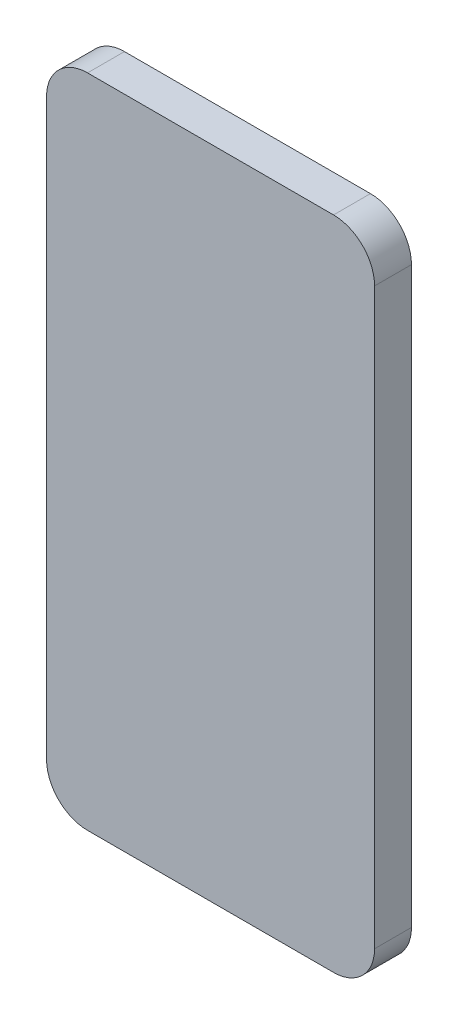
ISO-10303-21;
HEADER;
FILE_DESCRIPTION(('STEP AP214'),'2;1');
FILE_NAME('part.step','',(''),(''),'','','');
FILE_SCHEMA(('AUTOMOTIVE_DESIGN { 1 0 10303 214 1 1 1 1 }'));
ENDSEC;
DATA;
#1=APPLICATION_CONTEXT('core data for automotive mechanical design processes');
#2=APPLICATION_PROTOCOL_DEFINITION('international standard','automotive_design',2000,#1);
#3=PRODUCT_CONTEXT('',#1,'mechanical');
#4=PRODUCT('Part','Part','',(#3));
#5=PRODUCT_RELATED_PRODUCT_CATEGORY('part','',(#4));
#6=PRODUCT_DEFINITION_FORMATION('','',#4);
#7=PRODUCT_DEFINITION_CONTEXT('part definition',#1,'design');
#8=PRODUCT_DEFINITION('design','',#6,#7);
#9=PRODUCT_DEFINITION_SHAPE('','',#8);
#10=(LENGTH_UNIT() NAMED_UNIT(*) SI_UNIT(.MILLI.,.METRE.));
#11=(NAMED_UNIT(*) PLANE_ANGLE_UNIT() SI_UNIT($,.RADIAN.));
#12=(NAMED_UNIT(*) SI_UNIT($,.STERADIAN.) SOLID_ANGLE_UNIT());
#13=UNCERTAINTY_MEASURE_WITH_UNIT(LENGTH_MEASURE(1.E-05),#10,'distance_accuracy_value','');
#14=(GEOMETRIC_REPRESENTATION_CONTEXT(3) GLOBAL_UNCERTAINTY_ASSIGNED_CONTEXT((#13)) GLOBAL_UNIT_ASSIGNED_CONTEXT((#10,
#11,#12)) REPRESENTATION_CONTEXT('',''));
#15=CARTESIAN_POINT('',(0.,0.,0.));
#16=DIRECTION('',(0.,0.,1.));
#17=DIRECTION('',(1.,0.,0.));
#18=AXIS2_PLACEMENT_3D('',#15,#16,#17);
#19=CARTESIAN_POINT('',(-29.1735537190082,-109.338842975207,9.));
#20=DIRECTION('',(0.,0.,-1.));
#21=DIRECTION('',(-1.,0.,0.));
#22=AXIS2_PLACEMENT_3D('',#19,#20,#21);
#23=CYLINDRICAL_SURFACE('',#22,10.);
#24=DIRECTION('',(0.,0.,-1.));
#25=VECTOR('',#24,1.);
#26=CARTESIAN_POINT('',(-29.1735537190082,-119.338842975207,9.));
#27=LINE('',#26,#25);
#28=CARTESIAN_POINT('',(-29.1735537190082,-119.338842975207,9.));
#29=VERTEX_POINT('',#28);
#30=CARTESIAN_POINT('',(-29.1735537190082,-119.338842975207,0.));
#31=VERTEX_POINT('',#30);
#32=EDGE_CURVE('E168',#29,#31,#27,.T.);
#33=ORIENTED_EDGE('',*,*,#32,.F.);
#34=CARTESIAN_POINT('',(-29.1735537190082,-109.338842975207,9.));
#35=DIRECTION('',(0.,0.,1.));
#36=DIRECTION('',(1.,0.,0.));
#37=AXIS2_PLACEMENT_3D('',#34,#35,#36);
#38=CIRCLE('',#37,10.);
#39=CARTESIAN_POINT('',(-39.1735537190082,-109.338842975207,9.));
#40=VERTEX_POINT('',#39);
#41=EDGE_CURVE('E47',#40,#29,#38,.T.);
#42=ORIENTED_EDGE('',*,*,#41,.F.);
#43=DIRECTION('',(0.,0.,-1.));
#44=VECTOR('',#43,1.);
#45=CARTESIAN_POINT('',(-39.1735537190082,-109.338842975207,9.));
#46=LINE('',#45,#44);
#47=CARTESIAN_POINT('',(-39.1735537190082,-109.338842975207,0.));
#48=VERTEX_POINT('',#47);
#49=EDGE_CURVE('E172',#48,#40,#46,.F.);
#50=ORIENTED_EDGE('',*,*,#49,.F.);
#51=CARTESIAN_POINT('',(-29.1735537190082,-109.338842975207,0.));
#52=DIRECTION('',(0.,0.,1.));
#53=DIRECTION('',(1.,0.,0.));
#54=AXIS2_PLACEMENT_3D('',#51,#52,#53);
#55=CIRCLE('',#54,10.);
#56=EDGE_CURVE('E11',#31,#48,#55,.F.);
#57=ORIENTED_EDGE('',*,*,#56,.F.);
#58=EDGE_LOOP('',(#33,#42,#50,#57));
#59=FACE_BOUND('',#58,.T.);
#60=ADVANCED_FACE('F39',(#59),#23,.T.);
#61=CARTESIAN_POINT('',(30.8264462809918,-109.338842975207,9.));
#62=DIRECTION('',(0.,0.,-1.));
#63=DIRECTION('',(-1.,0.,0.));
#64=AXIS2_PLACEMENT_3D('',#61,#62,#63);
#65=CYLINDRICAL_SURFACE('',#64,10.);
#66=DIRECTION('',(0.,0.,-1.));
#67=VECTOR('',#66,1.);
#68=CARTESIAN_POINT('',(40.8264462809918,-109.338842975207,9.));
#69=LINE('',#68,#67);
#70=CARTESIAN_POINT('',(40.8264462809918,-109.338842975207,9.));
#71=VERTEX_POINT('',#70);
#72=CARTESIAN_POINT('',(40.8264462809918,-109.338842975207,0.));
#73=VERTEX_POINT('',#72);
#74=EDGE_CURVE('E153',#71,#73,#69,.T.);
#75=ORIENTED_EDGE('',*,*,#74,.F.);
#76=CARTESIAN_POINT('',(30.8264462809918,-109.338842975207,9.));
#77=DIRECTION('',(0.,0.,1.));
#78=DIRECTION('',(1.,0.,0.));
#79=AXIS2_PLACEMENT_3D('',#76,#77,#78);
#80=CIRCLE('',#79,10.);
#81=CARTESIAN_POINT('',(30.8264462809918,-119.338842975207,9.));
#82=VERTEX_POINT('',#81);
#83=EDGE_CURVE('E161',#82,#71,#80,.T.);
#84=ORIENTED_EDGE('',*,*,#83,.F.);
#85=DIRECTION('',(0.,0.,-1.));
#86=VECTOR('',#85,1.);
#87=CARTESIAN_POINT('',(30.8264462809918,-119.338842975207,9.));
#88=LINE('',#87,#86);
#89=CARTESIAN_POINT('',(30.8264462809918,-119.338842975207,0.));
#90=VERTEX_POINT('',#89);
#91=EDGE_CURVE('E157',#90,#82,#88,.F.);
#92=ORIENTED_EDGE('',*,*,#91,.F.);
#93=CARTESIAN_POINT('',(30.8264462809918,-109.338842975207,0.));
#94=DIRECTION('',(0.,0.,1.));
#95=DIRECTION('',(1.,0.,0.));
#96=AXIS2_PLACEMENT_3D('',#93,#94,#95);
#97=CIRCLE('',#96,10.);
#98=EDGE_CURVE('E164',#73,#90,#97,.F.);
#99=ORIENTED_EDGE('',*,*,#98,.F.);
#100=EDGE_LOOP('',(#75,#84,#92,#99));
#101=FACE_BOUND('',#100,.T.);
#102=ADVANCED_FACE('F207',(#101),#65,.T.);
#103=CARTESIAN_POINT('',(30.8264462809918,30.6611570247934,9.));
#104=DIRECTION('',(0.,0.,-1.));
#105=DIRECTION('',(-1.,0.,0.));
#106=AXIS2_PLACEMENT_3D('',#103,#104,#105);
#107=CYLINDRICAL_SURFACE('',#106,10.);
#108=DIRECTION('',(0.,0.,-1.));
#109=VECTOR('',#108,1.);
#110=CARTESIAN_POINT('',(30.8264462809918,40.6611570247934,9.));
#111=LINE('',#110,#109);
#112=CARTESIAN_POINT('',(30.8264462809918,40.6611570247934,9.));
#113=VERTEX_POINT('',#112);
#114=CARTESIAN_POINT('',(30.8264462809918,40.6611570247934,0.));
#115=VERTEX_POINT('',#114);
#116=EDGE_CURVE('E110',#113,#115,#111,.T.);
#117=ORIENTED_EDGE('',*,*,#116,.F.);
#118=CARTESIAN_POINT('',(30.8264462809918,30.6611570247934,9.));
#119=DIRECTION('',(0.,0.,1.));
#120=DIRECTION('',(1.,0.,0.));
#121=AXIS2_PLACEMENT_3D('',#118,#119,#120);
#122=CIRCLE('',#121,10.);
#123=CARTESIAN_POINT('',(40.8264462809918,30.6611570247934,9.));
#124=VERTEX_POINT('',#123);
#125=EDGE_CURVE('E147',#124,#113,#122,.T.);
#126=ORIENTED_EDGE('',*,*,#125,.F.);
#127=DIRECTION('',(0.,0.,-1.));
#128=VECTOR('',#127,1.);
#129=CARTESIAN_POINT('',(40.8264462809918,30.6611570247934,9.));
#130=LINE('',#129,#128);
#131=CARTESIAN_POINT('',(40.8264462809918,30.6611570247934,0.));
#132=VERTEX_POINT('',#131);
#133=EDGE_CURVE('E143',#132,#124,#130,.F.);
#134=ORIENTED_EDGE('',*,*,#133,.F.);
#135=CARTESIAN_POINT('',(30.8264462809918,30.6611570247934,0.));
#136=DIRECTION('',(0.,0.,1.));
#137=DIRECTION('',(1.,0.,0.));
#138=AXIS2_PLACEMENT_3D('',#135,#136,#137);
#139=CIRCLE('',#138,10.);
#140=EDGE_CURVE('E150',#115,#132,#139,.F.);
#141=ORIENTED_EDGE('',*,*,#140,.F.);
#142=EDGE_LOOP('',(#117,#126,#134,#141));
#143=FACE_BOUND('',#142,.T.);
#144=ADVANCED_FACE('F205',(#143),#107,.T.);
#145=CARTESIAN_POINT('',(-29.1735537190082,30.6611570247934,9.));
#146=DIRECTION('',(0.,0.,1.));
#147=DIRECTION('',(1.,0.,0.));
#148=AXIS2_PLACEMENT_3D('',#145,#146,#147);
#149=CYLINDRICAL_SURFACE('',#148,10.);
#150=DIRECTION('',(0.,0.,1.));
#151=VECTOR('',#150,1.);
#152=CARTESIAN_POINT('',(-29.1735537190082,40.6611570247934,9.));
#153=LINE('',#152,#151);
#154=CARTESIAN_POINT('',(-29.1735537190082,40.6611570247934,0.));
#155=VERTEX_POINT('',#154);
#156=CARTESIAN_POINT('',(-29.1735537190082,40.6611570247934,9.));
#157=VERTEX_POINT('',#156);
#158=EDGE_CURVE('E108',#155,#157,#153,.T.);
#159=ORIENTED_EDGE('',*,*,#158,.F.);
#160=CARTESIAN_POINT('',(-29.1735537190082,30.6611570247934,0.));
#161=DIRECTION('',(0.,0.,1.));
#162=DIRECTION('',(1.,0.,0.));
#163=AXIS2_PLACEMENT_3D('',#160,#161,#162);
#164=CIRCLE('',#163,10.);
#165=CARTESIAN_POINT('',(-39.1735537190082,30.6611570247934,0.));
#166=VERTEX_POINT('',#165);
#167=EDGE_CURVE('E116',#166,#155,#164,.F.);
#168=ORIENTED_EDGE('',*,*,#167,.F.);
#169=DIRECTION('',(0.,0.,1.));
#170=VECTOR('',#169,1.);
#171=CARTESIAN_POINT('',(-39.1735537190082,30.6611570247934,9.));
#172=LINE('',#171,#170);
#173=CARTESIAN_POINT('',(-39.1735537190082,30.6611570247934,9.));
#174=VERTEX_POINT('',#173);
#175=EDGE_CURVE('E125',#174,#166,#172,.F.);
#176=ORIENTED_EDGE('',*,*,#175,.F.);
#177=CARTESIAN_POINT('',(-29.1735537190082,30.6611570247934,9.));
#178=DIRECTION('',(0.,0.,1.));
#179=DIRECTION('',(1.,0.,0.));
#180=AXIS2_PLACEMENT_3D('',#177,#178,#179);
#181=CIRCLE('',#180,10.);
#182=EDGE_CURVE('E124',#157,#174,#181,.T.);
#183=ORIENTED_EDGE('',*,*,#182,.F.);
#184=EDGE_LOOP('',(#159,#168,#176,#183));
#185=FACE_BOUND('',#184,.T.);
#186=ADVANCED_FACE('F128',(#185),#149,.T.);
#187=CARTESIAN_POINT('',(-39.1735537190082,40.6611570247934,9.));
#188=DIRECTION('',(1.,0.,0.));
#189=DIRECTION('',(0.,1.,0.));
#190=AXIS2_PLACEMENT_3D('',#187,#188,#189);
#191=PLANE('',#190);
#192=DIRECTION('',(0.,-1.,0.));
#193=VECTOR('',#192,1.);
#194=CARTESIAN_POINT('',(-39.1735537190082,40.6611570247934,0.));
#195=LINE('',#194,#193);
#196=EDGE_CURVE('E119',#166,#48,#195,.T.);
#197=ORIENTED_EDGE('',*,*,#196,.T.);
#198=ORIENTED_EDGE('',*,*,#49,.T.);
#199=DIRECTION('',(0.,-1.,0.));
#200=VECTOR('',#199,1.);
#201=CARTESIAN_POINT('',(-39.1735537190082,40.6611570247934,9.));
#202=LINE('',#201,#200);
#203=EDGE_CURVE('E113',#174,#40,#202,.T.);
#204=ORIENTED_EDGE('',*,*,#203,.F.);
#205=ORIENTED_EDGE('',*,*,#175,.T.);
#206=EDGE_LOOP('',(#197,#198,#204,#205));
#207=FACE_BOUND('',#206,.T.);
#208=ADVANCED_FACE('F217',(#207),#191,.F.);
#209=CARTESIAN_POINT('',(-39.1735537190082,-119.338842975207,9.));
#210=DIRECTION('',(0.,1.,0.));
#211=DIRECTION('',(0.,0.,1.));
#212=AXIS2_PLACEMENT_3D('',#209,#210,#211);
#213=PLANE('',#212);
#214=DIRECTION('',(1.,0.,0.));
#215=VECTOR('',#214,1.);
#216=CARTESIAN_POINT('',(-39.1735537190082,-119.338842975207,9.));
#217=LINE('',#216,#215);
#218=EDGE_CURVE('E179',#29,#82,#217,.T.);
#219=ORIENTED_EDGE('',*,*,#218,.F.);
#220=ORIENTED_EDGE('',*,*,#32,.T.);
#221=DIRECTION('',(1.,0.,0.));
#222=VECTOR('',#221,1.);
#223=CARTESIAN_POINT('',(-39.1735537190082,-119.338842975207,0.));
#224=LINE('',#223,#222);
#225=EDGE_CURVE('E194',#31,#90,#224,.T.);
#226=ORIENTED_EDGE('',*,*,#225,.T.);
#227=ORIENTED_EDGE('',*,*,#91,.T.);
#228=EDGE_LOOP('',(#219,#220,#226,#227));
#229=FACE_BOUND('',#228,.T.);
#230=ADVANCED_FACE('F183',(#229),#213,.F.);
#231=CARTESIAN_POINT('',(40.8264462809918,40.6611570247934,9.));
#232=DIRECTION('',(-1.,0.,0.));
#233=DIRECTION('',(0.,-1.,0.));
#234=AXIS2_PLACEMENT_3D('',#231,#232,#233);
#235=PLANE('',#234);
#236=DIRECTION('',(0.,1.,0.));
#237=VECTOR('',#236,1.);
#238=CARTESIAN_POINT('',(40.8264462809918,40.6611570247934,9.));
#239=LINE('',#238,#237);
#240=EDGE_CURVE('E135',#71,#124,#239,.T.);
#241=ORIENTED_EDGE('',*,*,#240,.F.);
#242=ORIENTED_EDGE('',*,*,#74,.T.);
#243=DIRECTION('',(0.,1.,0.));
#244=VECTOR('',#243,1.);
#245=CARTESIAN_POINT('',(40.8264462809918,40.6611570247934,0.));
#246=LINE('',#245,#244);
#247=EDGE_CURVE('E114',#73,#132,#246,.T.);
#248=ORIENTED_EDGE('',*,*,#247,.T.);
#249=ORIENTED_EDGE('',*,*,#133,.T.);
#250=EDGE_LOOP('',(#241,#242,#248,#249));
#251=FACE_BOUND('',#250,.T.);
#252=ADVANCED_FACE('F200',(#251),#235,.F.);
#253=CARTESIAN_POINT('',(-39.1735537190082,40.6611570247934,9.));
#254=DIRECTION('',(0.,-1.,0.));
#255=DIRECTION('',(0.,0.,-1.));
#256=AXIS2_PLACEMENT_3D('',#253,#254,#255);
#257=PLANE('',#256);
#258=DIRECTION('',(-1.,0.,0.));
#259=VECTOR('',#258,1.);
#260=CARTESIAN_POINT('',(-39.1735537190082,40.6611570247934,9.));
#261=LINE('',#260,#259);
#262=EDGE_CURVE('E130',#113,#157,#261,.T.);
#263=ORIENTED_EDGE('',*,*,#262,.F.);
#264=ORIENTED_EDGE('',*,*,#116,.T.);
#265=DIRECTION('',(-1.,0.,0.));
#266=VECTOR('',#265,1.);
#267=CARTESIAN_POINT('',(-39.1735537190082,40.6611570247934,0.));
#268=LINE('',#267,#266);
#269=EDGE_CURVE('E103',#115,#155,#268,.T.);
#270=ORIENTED_EDGE('',*,*,#269,.T.);
#271=ORIENTED_EDGE('',*,*,#158,.T.);
#272=EDGE_LOOP('',(#263,#264,#270,#271));
#273=FACE_BOUND('',#272,.T.);
#274=ADVANCED_FACE('F106',(#273),#257,.F.);
#275=CARTESIAN_POINT('',(0.,0.,9.));
#276=DIRECTION('',(0.,0.,1.));
#277=DIRECTION('',(1.,0.,0.));
#278=AXIS2_PLACEMENT_3D('',#275,#276,#277);
#279=PLANE('',#278);
#280=ORIENTED_EDGE('',*,*,#203,.T.);
#281=ORIENTED_EDGE('',*,*,#41,.T.);
#282=ORIENTED_EDGE('',*,*,#218,.T.);
#283=ORIENTED_EDGE('',*,*,#83,.T.);
#284=ORIENTED_EDGE('',*,*,#240,.T.);
#285=ORIENTED_EDGE('',*,*,#125,.T.);
#286=ORIENTED_EDGE('',*,*,#262,.T.);
#287=ORIENTED_EDGE('',*,*,#182,.T.);
#288=EDGE_LOOP('',(#280,#281,#282,#283,#284,#285,#286,#287));
#289=FACE_BOUND('',#288,.T.);
#290=ADVANCED_FACE('F177',(#289),#279,.T.);
#291=CARTESIAN_POINT('',(0.,0.,0.));
#292=DIRECTION('',(0.,0.,1.));
#293=DIRECTION('',(1.,0.,0.));
#294=AXIS2_PLACEMENT_3D('',#291,#292,#293);
#295=PLANE('',#294);
#296=ORIENTED_EDGE('',*,*,#225,.F.);
#297=ORIENTED_EDGE('',*,*,#56,.T.);
#298=ORIENTED_EDGE('',*,*,#196,.F.);
#299=ORIENTED_EDGE('',*,*,#167,.T.);
#300=ORIENTED_EDGE('',*,*,#269,.F.);
#301=ORIENTED_EDGE('',*,*,#140,.T.);
#302=ORIENTED_EDGE('',*,*,#247,.F.);
#303=ORIENTED_EDGE('',*,*,#98,.T.);
#304=EDGE_LOOP('',(#296,#297,#298,#299,#300,#301,#302,#303));
#305=FACE_BOUND('',#304,.T.);
#306=ADVANCED_FACE('F117',(#305),#295,.F.);
#307=CLOSED_SHELL('',(#60,#102,#144,#186,#208,#230,#252,#274,#290,#306));
#308=MANIFOLD_SOLID_BREP('B2',#307);
#309=ADVANCED_BREP_SHAPE_REPRESENTATION('',(#18,#308),#14);
#310=SHAPE_DEFINITION_REPRESENTATION(#9,#309);
ENDSEC;
END-ISO-10303-21;
